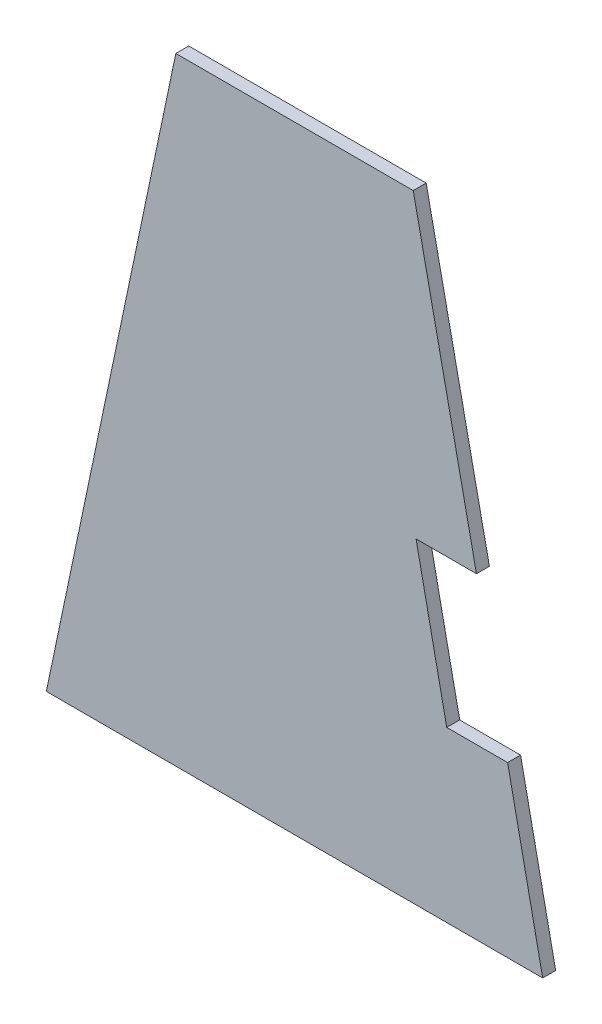
ISO-10303-21;
HEADER;
FILE_DESCRIPTION(('STEP AP214'),'2;1');
FILE_NAME('part.step','',(''),(''),'','','');
FILE_SCHEMA(('AUTOMOTIVE_DESIGN { 1 0 10303 214 1 1 1 1 }'));
ENDSEC;
DATA;
#1=APPLICATION_CONTEXT('core data for automotive mechanical design processes');
#2=APPLICATION_PROTOCOL_DEFINITION('international standard','automotive_design',2000,#1);
#3=PRODUCT_CONTEXT('',#1,'mechanical');
#4=PRODUCT('Part','Part','',(#3));
#5=PRODUCT_RELATED_PRODUCT_CATEGORY('part','',(#4));
#6=PRODUCT_DEFINITION_FORMATION('','',#4);
#7=PRODUCT_DEFINITION_CONTEXT('part definition',#1,'design');
#8=PRODUCT_DEFINITION('design','',#6,#7);
#9=PRODUCT_DEFINITION_SHAPE('','',#8);
#10=(LENGTH_UNIT() NAMED_UNIT(*) SI_UNIT(.MILLI.,.METRE.));
#11=(NAMED_UNIT(*) PLANE_ANGLE_UNIT() SI_UNIT($,.RADIAN.));
#12=(NAMED_UNIT(*) SI_UNIT($,.STERADIAN.) SOLID_ANGLE_UNIT());
#13=UNCERTAINTY_MEASURE_WITH_UNIT(LENGTH_MEASURE(1.E-05),#10,'distance_accuracy_value','');
#14=(GEOMETRIC_REPRESENTATION_CONTEXT(3) GLOBAL_UNCERTAINTY_ASSIGNED_CONTEXT((#13)) GLOBAL_UNIT_ASSIGNED_CONTEXT((#10,
#11,#12)) REPRESENTATION_CONTEXT('',''));
#15=CARTESIAN_POINT('',(0.,0.,0.));
#16=DIRECTION('',(0.,0.,1.));
#17=DIRECTION('',(1.,0.,0.));
#18=AXIS2_PLACEMENT_3D('',#15,#16,#17);
#19=CARTESIAN_POINT('',(85.6527369679343,73.4349327902008,3.));
#20=DIRECTION('',(0.,1.,0.));
#21=DIRECTION('',(-1.,0.,0.));
#22=AXIS2_PLACEMENT_3D('',#19,#20,#21);
#23=PLANE('',#22);
#24=DIRECTION('',(1.,0.,0.));
#25=VECTOR('',#24,1.);
#26=CARTESIAN_POINT('',(85.6527369679343,73.4349327902008,0.));
#27=LINE('',#26,#25);
#28=CARTESIAN_POINT('',(85.6527369679343,73.4349327902008,0.));
#29=VERTEX_POINT('',#28);
#30=CARTESIAN_POINT('',(99.6527369679343,73.4349327902008,0.));
#31=VERTEX_POINT('',#30);
#32=EDGE_CURVE('E133',#29,#31,#27,.T.);
#33=ORIENTED_EDGE('',*,*,#32,.T.);
#34=DIRECTION('',(0.,0.,-1.));
#35=VECTOR('',#34,1.);
#36=CARTESIAN_POINT('',(99.6527369679343,73.4349327902008,3.));
#37=LINE('',#36,#35);
#38=CARTESIAN_POINT('',(99.6527369679343,73.4349327902008,3.));
#39=VERTEX_POINT('',#38);
#40=EDGE_CURVE('E11',#39,#31,#37,.T.);
#41=ORIENTED_EDGE('',*,*,#40,.F.);
#42=DIRECTION('',(1.,0.,0.));
#43=VECTOR('',#42,1.);
#44=CARTESIAN_POINT('',(85.6527369679343,73.4349327902008,3.));
#45=LINE('',#44,#43);
#46=CARTESIAN_POINT('',(85.6527369679343,73.4349327902008,3.));
#47=VERTEX_POINT('',#46);
#48=EDGE_CURVE('E147',#47,#39,#45,.T.);
#49=ORIENTED_EDGE('',*,*,#48,.F.);
#50=DIRECTION('',(0.,0.,-1.));
#51=VECTOR('',#50,1.);
#52=CARTESIAN_POINT('',(85.6527369679343,73.4349327902008,3.));
#53=LINE('',#52,#51);
#54=EDGE_CURVE('E129',#47,#29,#53,.T.);
#55=ORIENTED_EDGE('',*,*,#54,.T.);
#56=EDGE_LOOP('',(#33,#41,#49,#55));
#57=FACE_BOUND('',#56,.T.);
#58=ADVANCED_FACE('F37',(#57),#23,.F.);
#59=CARTESIAN_POINT('',(99.6527369679343,73.4349327902008,3.));
#60=DIRECTION('',(-0.978528626747034,-0.206110957099723,0.));
#61=DIRECTION('',(0.206110957099723,-0.978528626747034,0.));
#62=AXIS2_PLACEMENT_3D('',#59,#60,#61);
#63=PLANE('',#62);
#64=DIRECTION('',(-0.206110957099723,0.978528626747034,0.));
#65=VECTOR('',#64,1.);
#66=CARTESIAN_POINT('',(99.6527369679343,73.4349327902008,0.));
#67=LINE('',#66,#65);
#68=CARTESIAN_POINT('',(85.,143.,0.));
#69=VERTEX_POINT('',#68);
#70=EDGE_CURVE('E136',#31,#69,#67,.T.);
#71=ORIENTED_EDGE('',*,*,#70,.T.);
#72=DIRECTION('',(0.,0.,-1.));
#73=VECTOR('',#72,1.);
#74=CARTESIAN_POINT('',(85.,143.,3.));
#75=LINE('',#74,#73);
#76=CARTESIAN_POINT('',(85.,143.,3.));
#77=VERTEX_POINT('',#76);
#78=EDGE_CURVE('E45',#77,#69,#75,.T.);
#79=ORIENTED_EDGE('',*,*,#78,.F.);
#80=DIRECTION('',(-0.206110957099723,0.978528626747034,0.));
#81=VECTOR('',#80,1.);
#82=CARTESIAN_POINT('',(99.6527369679343,73.4349327902008,3.));
#83=LINE('',#82,#81);
#84=EDGE_CURVE('E96',#39,#77,#83,.T.);
#85=ORIENTED_EDGE('',*,*,#84,.F.);
#86=ORIENTED_EDGE('',*,*,#40,.T.);
#87=EDGE_LOOP('',(#71,#79,#85,#86));
#88=FACE_BOUND('',#87,.T.);
#89=ADVANCED_FACE('F182',(#88),#63,.F.);
#90=CARTESIAN_POINT('',(85.,143.,3.));
#91=DIRECTION('',(0.,-1.,0.));
#92=DIRECTION('',(0.,0.,-1.));
#93=AXIS2_PLACEMENT_3D('',#90,#91,#92);
#94=PLANE('',#93);
#95=DIRECTION('',(-1.,0.,0.));
#96=VECTOR('',#95,1.);
#97=CARTESIAN_POINT('',(85.,143.,0.));
#98=LINE('',#97,#96);
#99=CARTESIAN_POINT('',(30.,143.,0.));
#100=VERTEX_POINT('',#99);
#101=EDGE_CURVE('E138',#69,#100,#98,.T.);
#102=ORIENTED_EDGE('',*,*,#101,.T.);
#103=DIRECTION('',(0.,0.,-1.));
#104=VECTOR('',#103,1.);
#105=CARTESIAN_POINT('',(30.,143.,3.));
#106=LINE('',#105,#104);
#107=CARTESIAN_POINT('',(30.,143.,3.));
#108=VERTEX_POINT('',#107);
#109=EDGE_CURVE('E154',#108,#100,#106,.T.);
#110=ORIENTED_EDGE('',*,*,#109,.F.);
#111=DIRECTION('',(-1.,0.,0.));
#112=VECTOR('',#111,1.);
#113=CARTESIAN_POINT('',(85.,143.,3.));
#114=LINE('',#113,#112);
#115=EDGE_CURVE('E162',#77,#108,#114,.T.);
#116=ORIENTED_EDGE('',*,*,#115,.F.);
#117=ORIENTED_EDGE('',*,*,#78,.T.);
#118=EDGE_LOOP('',(#102,#110,#116,#117));
#119=FACE_BOUND('',#118,.T.);
#120=ADVANCED_FACE('F160',(#119),#94,.F.);
#121=CARTESIAN_POINT('',(30.,143.,3.));
#122=DIRECTION('',(0.97869477300638,-0.20532058174959,0.));
#123=DIRECTION('',(0.20532058174959,0.97869477300638,0.));
#124=AXIS2_PLACEMENT_3D('',#121,#122,#123);
#125=PLANE('',#124);
#126=DIRECTION('',(-0.20532058174959,-0.97869477300638,0.));
#127=VECTOR('',#126,1.);
#128=CARTESIAN_POINT('',(30.,143.,0.));
#129=LINE('',#128,#127);
#130=CARTESIAN_POINT('',(0.,0.,0.));
#131=VERTEX_POINT('',#130);
#132=EDGE_CURVE('E140',#100,#131,#129,.T.);
#133=ORIENTED_EDGE('',*,*,#132,.T.);
#134=DIRECTION('',(0.,0.,-1.));
#135=VECTOR('',#134,1.);
#136=CARTESIAN_POINT('',(0.,0.,3.));
#137=LINE('',#136,#135);
#138=CARTESIAN_POINT('',(0.,0.,3.));
#139=VERTEX_POINT('',#138);
#140=EDGE_CURVE('E151',#139,#131,#137,.T.);
#141=ORIENTED_EDGE('',*,*,#140,.F.);
#142=DIRECTION('',(-0.20532058174959,-0.97869477300638,0.));
#143=VECTOR('',#142,1.);
#144=CARTESIAN_POINT('',(30.,143.,3.));
#145=LINE('',#144,#143);
#146=EDGE_CURVE('E174',#108,#139,#145,.T.);
#147=ORIENTED_EDGE('',*,*,#146,.F.);
#148=ORIENTED_EDGE('',*,*,#109,.T.);
#149=EDGE_LOOP('',(#133,#141,#147,#148));
#150=FACE_BOUND('',#149,.T.);
#151=ADVANCED_FACE('F170',(#150),#125,.F.);
#152=CARTESIAN_POINT('',(0.,0.,3.));
#153=DIRECTION('',(0.,1.,0.));
#154=DIRECTION('',(0.,0.,1.));
#155=AXIS2_PLACEMENT_3D('',#152,#153,#154);
#156=PLANE('',#155);
#157=DIRECTION('',(1.,0.,0.));
#158=VECTOR('',#157,1.);
#159=CARTESIAN_POINT('',(0.,0.,0.));
#160=LINE('',#159,#158);
#161=CARTESIAN_POINT('',(115.,0.,0.));
#162=VERTEX_POINT('',#161);
#163=EDGE_CURVE('E142',#131,#162,#160,.T.);
#164=ORIENTED_EDGE('',*,*,#163,.T.);
#165=DIRECTION('',(0.,0.,-1.));
#166=VECTOR('',#165,1.);
#167=CARTESIAN_POINT('',(115.,0.,3.));
#168=LINE('',#167,#166);
#169=CARTESIAN_POINT('',(115.,0.,3.));
#170=VERTEX_POINT('',#169);
#171=EDGE_CURVE('E124',#170,#162,#168,.T.);
#172=ORIENTED_EDGE('',*,*,#171,.F.);
#173=DIRECTION('',(1.,0.,0.));
#174=VECTOR('',#173,1.);
#175=CARTESIAN_POINT('',(0.,0.,3.));
#176=LINE('',#175,#174);
#177=EDGE_CURVE('E115',#139,#170,#176,.T.);
#178=ORIENTED_EDGE('',*,*,#177,.F.);
#179=ORIENTED_EDGE('',*,*,#140,.T.);
#180=EDGE_LOOP('',(#164,#172,#178,#179));
#181=FACE_BOUND('',#180,.T.);
#182=ADVANCED_FACE('F173',(#181),#156,.F.);
#183=CARTESIAN_POINT('',(115.,0.,3.));
#184=DIRECTION('',(-0.979132437202677,-0.203223203442778,0.));
#185=DIRECTION('',(0.203223203442778,-0.979132437202678,0.));
#186=AXIS2_PLACEMENT_3D('',#183,#184,#185);
#187=PLANE('',#186);
#188=DIRECTION('',(-0.203223203442778,0.979132437202678,0.));
#189=VECTOR('',#188,1.);
#190=CARTESIAN_POINT('',(115.,0.,0.));
#191=LINE('',#190,#189);
#192=CARTESIAN_POINT('',(106.871071862289,39.1652974881071,0.));
#193=VERTEX_POINT('',#192);
#194=EDGE_CURVE('E123',#162,#193,#191,.T.);
#195=ORIENTED_EDGE('',*,*,#194,.T.);
#196=DIRECTION('',(0.,0.,-1.));
#197=VECTOR('',#196,1.);
#198=CARTESIAN_POINT('',(106.871071862289,39.1652974881071,3.));
#199=LINE('',#198,#197);
#200=CARTESIAN_POINT('',(106.871071862289,39.1652974881071,3.));
#201=VERTEX_POINT('',#200);
#202=EDGE_CURVE('E120',#201,#193,#199,.T.);
#203=ORIENTED_EDGE('',*,*,#202,.F.);
#204=DIRECTION('',(-0.203223203442778,0.979132437202678,0.));
#205=VECTOR('',#204,1.);
#206=CARTESIAN_POINT('',(115.,0.,3.));
#207=LINE('',#206,#205);
#208=EDGE_CURVE('E109',#170,#201,#207,.T.);
#209=ORIENTED_EDGE('',*,*,#208,.F.);
#210=ORIENTED_EDGE('',*,*,#171,.T.);
#211=EDGE_LOOP('',(#195,#203,#209,#210));
#212=FACE_BOUND('',#211,.T.);
#213=ADVANCED_FACE('F121',(#212),#187,.F.);
#214=CARTESIAN_POINT('',(106.871071862289,39.1652974881071,3.));
#215=DIRECTION('',(0.,-1.,0.));
#216=DIRECTION('',(1.,0.,0.));
#217=AXIS2_PLACEMENT_3D('',#214,#215,#216);
#218=PLANE('',#217);
#219=DIRECTION('',(-1.,0.,0.));
#220=VECTOR('',#219,1.);
#221=CARTESIAN_POINT('',(106.871071862289,39.1652974881071,0.));
#222=LINE('',#221,#220);
#223=CARTESIAN_POINT('',(92.7655490884316,39.1652974881071,0.));
#224=VERTEX_POINT('',#223);
#225=EDGE_CURVE('E82',#193,#224,#222,.T.);
#226=ORIENTED_EDGE('',*,*,#225,.T.);
#227=DIRECTION('',(0.,0.,-1.));
#228=VECTOR('',#227,1.);
#229=CARTESIAN_POINT('',(92.7655490884316,39.1652974881071,3.));
#230=LINE('',#229,#228);
#231=CARTESIAN_POINT('',(92.7655490884316,39.1652974881071,3.));
#232=VERTEX_POINT('',#231);
#233=EDGE_CURVE('E125',#232,#224,#230,.T.);
#234=ORIENTED_EDGE('',*,*,#233,.F.);
#235=DIRECTION('',(-1.,0.,0.));
#236=VECTOR('',#235,1.);
#237=CARTESIAN_POINT('',(106.871071862289,39.1652974881071,3.));
#238=LINE('',#237,#236);
#239=EDGE_CURVE('E113',#201,#232,#238,.T.);
#240=ORIENTED_EDGE('',*,*,#239,.F.);
#241=ORIENTED_EDGE('',*,*,#202,.T.);
#242=EDGE_LOOP('',(#226,#234,#240,#241));
#243=FACE_BOUND('',#242,.T.);
#244=ADVANCED_FACE('F127',(#243),#218,.F.);
#245=CARTESIAN_POINT('',(92.7655490884316,39.1652974881071,3.));
#246=DIRECTION('',(-0.979132437202677,-0.203223203442778,0.));
#247=DIRECTION('',(0.203223203442779,-0.979132437202678,0.));
#248=AXIS2_PLACEMENT_3D('',#245,#246,#247);
#249=PLANE('',#248);
#250=DIRECTION('',(-0.203223203442778,0.979132437202677,0.));
#251=VECTOR('',#250,1.);
#252=CARTESIAN_POINT('',(92.7655490884316,39.1652974881071,0.));
#253=LINE('',#252,#251);
#254=EDGE_CURVE('E88',#224,#29,#253,.T.);
#255=ORIENTED_EDGE('',*,*,#254,.T.);
#256=ORIENTED_EDGE('',*,*,#54,.F.);
#257=DIRECTION('',(-0.203223203442778,0.979132437202677,0.));
#258=VECTOR('',#257,1.);
#259=CARTESIAN_POINT('',(92.7655490884316,39.1652974881071,3.));
#260=LINE('',#259,#258);
#261=EDGE_CURVE('E53',#232,#47,#260,.T.);
#262=ORIENTED_EDGE('',*,*,#261,.F.);
#263=ORIENTED_EDGE('',*,*,#233,.T.);
#264=EDGE_LOOP('',(#255,#256,#262,#263));
#265=FACE_BOUND('',#264,.T.);
#266=ADVANCED_FACE('F198',(#265),#249,.F.);
#267=CARTESIAN_POINT('',(0.,0.,3.));
#268=DIRECTION('',(0.,0.,1.));
#269=DIRECTION('',(1.,0.,0.));
#270=AXIS2_PLACEMENT_3D('',#267,#268,#269);
#271=PLANE('',#270);
#272=ORIENTED_EDGE('',*,*,#48,.T.);
#273=ORIENTED_EDGE('',*,*,#84,.T.);
#274=ORIENTED_EDGE('',*,*,#115,.T.);
#275=ORIENTED_EDGE('',*,*,#146,.T.);
#276=ORIENTED_EDGE('',*,*,#177,.T.);
#277=ORIENTED_EDGE('',*,*,#208,.T.);
#278=ORIENTED_EDGE('',*,*,#239,.T.);
#279=ORIENTED_EDGE('',*,*,#261,.T.);
#280=EDGE_LOOP('',(#272,#273,#274,#275,#276,#277,#278,#279));
#281=FACE_BOUND('',#280,.T.);
#282=ADVANCED_FACE('F111',(#281),#271,.T.);
#283=CARTESIAN_POINT('',(0.,0.,0.));
#284=DIRECTION('',(0.,0.,1.));
#285=DIRECTION('',(1.,0.,0.));
#286=AXIS2_PLACEMENT_3D('',#283,#284,#285);
#287=PLANE('',#286);
#288=ORIENTED_EDGE('',*,*,#32,.F.);
#289=ORIENTED_EDGE('',*,*,#254,.F.);
#290=ORIENTED_EDGE('',*,*,#225,.F.);
#291=ORIENTED_EDGE('',*,*,#194,.F.);
#292=ORIENTED_EDGE('',*,*,#163,.F.);
#293=ORIENTED_EDGE('',*,*,#132,.F.);
#294=ORIENTED_EDGE('',*,*,#101,.F.);
#295=ORIENTED_EDGE('',*,*,#70,.F.);
#296=EDGE_LOOP('',(#288,#289,#290,#291,#292,#293,#294,#295));
#297=FACE_BOUND('',#296,.T.);
#298=ADVANCED_FACE('F166',(#297),#287,.F.);
#299=CLOSED_SHELL('',(#58,#89,#120,#151,#182,#213,#244,#266,#282,#298));
#300=MANIFOLD_SOLID_BREP('B2',#299);
#301=ADVANCED_BREP_SHAPE_REPRESENTATION('',(#18,#300),#14);
#302=SHAPE_DEFINITION_REPRESENTATION(#9,#301);
ENDSEC;
END-ISO-10303-21;
